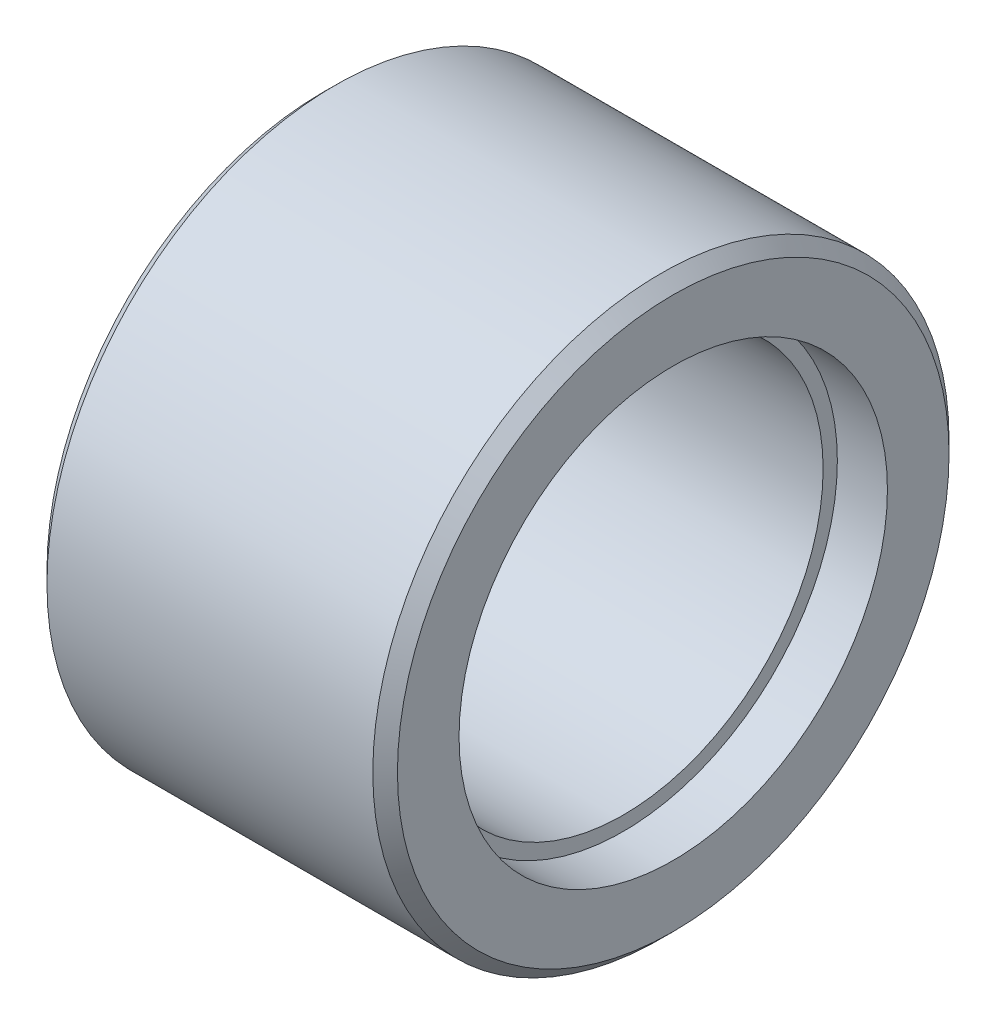
ISO-10303-21;
HEADER;
FILE_DESCRIPTION(('STEP AP214'),'2;1');
FILE_NAME('part.step','',(''),(''),'','','');
FILE_SCHEMA(('AUTOMOTIVE_DESIGN { 1 0 10303 214 1 1 1 1 }'));
ENDSEC;
DATA;
#1=APPLICATION_CONTEXT('core data for automotive mechanical design processes');
#2=APPLICATION_PROTOCOL_DEFINITION('international standard','automotive_design',2000,#1);
#3=PRODUCT_CONTEXT('',#1,'mechanical');
#4=PRODUCT('Part','Part','',(#3));
#5=PRODUCT_RELATED_PRODUCT_CATEGORY('part','',(#4));
#6=PRODUCT_DEFINITION_FORMATION('','',#4);
#7=PRODUCT_DEFINITION_CONTEXT('part definition',#1,'design');
#8=PRODUCT_DEFINITION('design','',#6,#7);
#9=PRODUCT_DEFINITION_SHAPE('','',#8);
#10=(LENGTH_UNIT() NAMED_UNIT(*) SI_UNIT(.MILLI.,.METRE.));
#11=(NAMED_UNIT(*) PLANE_ANGLE_UNIT() SI_UNIT($,.RADIAN.));
#12=(NAMED_UNIT(*) SI_UNIT($,.STERADIAN.) SOLID_ANGLE_UNIT());
#13=UNCERTAINTY_MEASURE_WITH_UNIT(LENGTH_MEASURE(1.E-05),#10,'distance_accuracy_value','');
#14=(GEOMETRIC_REPRESENTATION_CONTEXT(3) GLOBAL_UNCERTAINTY_ASSIGNED_CONTEXT((#13)) GLOBAL_UNIT_ASSIGNED_CONTEXT((#10,
#11,#12)) REPRESENTATION_CONTEXT('',''));
#15=CARTESIAN_POINT('',(0.,0.,0.));
#16=DIRECTION('',(0.,0.,1.));
#17=DIRECTION('',(1.,0.,0.));
#18=AXIS2_PLACEMENT_3D('',#15,#16,#17);
#19=CARTESIAN_POINT('',(-75.8996568668348,11.19315,0.));
#20=DIRECTION('',(-1.,0.,0.));
#21=DIRECTION('',(0.,0.,1.));
#22=AXIS2_PLACEMENT_3D('',#19,#20,#21);
#23=PLANE('',#22);
#24=CARTESIAN_POINT('',(-75.8996568668348,0.,0.));
#25=DIRECTION('',(1.,0.,0.));
#26=DIRECTION('',(0.,0.,-1.));
#27=AXIS2_PLACEMENT_3D('',#24,#25,#26);
#28=CIRCLE('',#27,8.69314999999999);
#29=CARTESIAN_POINT('',(-75.8996568668348,0.,-8.69314999999999));
#30=VERTEX_POINT('',#29);
#31=EDGE_CURVE('E10',#30,#30,#28,.T.);
#32=ORIENTED_EDGE('',*,*,#31,.T.);
#33=EDGE_LOOP('',(#32));
#34=FACE_BOUND('',#33,.T.);
#35=CARTESIAN_POINT('',(-75.8996568668348,0.,0.));
#36=DIRECTION('',(1.,0.,0.));
#37=DIRECTION('',(0.,0.,-1.));
#38=AXIS2_PLACEMENT_3D('',#35,#36,#37);
#39=CIRCLE('',#38,11.19315);
#40=CARTESIAN_POINT('',(-75.8996568668348,0.,-11.19315));
#41=VERTEX_POINT('',#40);
#42=EDGE_CURVE('E70',#41,#41,#39,.T.);
#43=ORIENTED_EDGE('',*,*,#42,.F.);
#44=EDGE_LOOP('',(#43));
#45=FACE_BOUND('',#44,.T.);
#46=ADVANCED_FACE('F36',(#34,#45),#23,.T.);
#47=CARTESIAN_POINT('',(0.,0.,0.));
#48=DIRECTION('',(1.,0.,0.));
#49=DIRECTION('',(0.,0.,-1.));
#50=AXIS2_PLACEMENT_3D('',#47,#48,#49);
#51=CYLINDRICAL_SURFACE('',#50,8.69314999999999);
#52=CARTESIAN_POINT('',(-73.8676568668348,0.,0.));
#53=DIRECTION('',(1.,0.,0.));
#54=DIRECTION('',(0.,0.,-1.));
#55=AXIS2_PLACEMENT_3D('',#52,#53,#54);
#56=CIRCLE('',#55,8.69314999999999);
#57=CARTESIAN_POINT('',(-73.8676568668348,0.,-8.69314999999999));
#58=VERTEX_POINT('',#57);
#59=EDGE_CURVE('E42',#58,#58,#56,.T.);
#60=ORIENTED_EDGE('',*,*,#59,.T.);
#61=EDGE_LOOP('',(#60));
#62=FACE_BOUND('',#61,.T.);
#63=ORIENTED_EDGE('',*,*,#31,.F.);
#64=EDGE_LOOP('',(#63));
#65=FACE_BOUND('',#64,.T.);
#66=ADVANCED_FACE('F78',(#62,#65),#51,.F.);
#67=CARTESIAN_POINT('',(-73.8676568668348,8.69314999999999,0.));
#68=DIRECTION('',(-1.,0.,0.));
#69=DIRECTION('',(0.,0.,1.));
#70=AXIS2_PLACEMENT_3D('',#67,#68,#69);
#71=PLANE('',#70);
#72=CARTESIAN_POINT('',(-73.8676568668348,0.,0.));
#73=DIRECTION('',(1.,0.,0.));
#74=DIRECTION('',(0.,0.,-1.));
#75=AXIS2_PLACEMENT_3D('',#72,#73,#74);
#76=CIRCLE('',#75,8.11529999999999);
#77=CARTESIAN_POINT('',(-73.8676568668348,0.,-8.11529999999999));
#78=VERTEX_POINT('',#77);
#79=EDGE_CURVE('E46',#78,#78,#76,.T.);
#80=ORIENTED_EDGE('',*,*,#79,.T.);
#81=EDGE_LOOP('',(#80));
#82=FACE_BOUND('',#81,.T.);
#83=ORIENTED_EDGE('',*,*,#59,.F.);
#84=EDGE_LOOP('',(#83));
#85=FACE_BOUND('',#84,.T.);
#86=ADVANCED_FACE('F82',(#82,#85),#71,.T.);
#87=CARTESIAN_POINT('',(0.,0.,0.));
#88=DIRECTION('',(1.,0.,0.));
#89=DIRECTION('',(0.,0.,-1.));
#90=AXIS2_PLACEMENT_3D('',#87,#88,#89);
#91=CYLINDRICAL_SURFACE('',#90,8.11529999999999);
#92=CARTESIAN_POINT('',(-63.7076568668348,0.,0.));
#93=DIRECTION('',(1.,0.,0.));
#94=DIRECTION('',(0.,0.,-1.));
#95=AXIS2_PLACEMENT_3D('',#92,#93,#94);
#96=CIRCLE('',#95,8.11529999999999);
#97=CARTESIAN_POINT('',(-63.7076568668348,0.,-8.11529999999999));
#98=VERTEX_POINT('',#97);
#99=EDGE_CURVE('E50',#98,#98,#96,.T.);
#100=ORIENTED_EDGE('',*,*,#99,.T.);
#101=EDGE_LOOP('',(#100));
#102=FACE_BOUND('',#101,.T.);
#103=ORIENTED_EDGE('',*,*,#79,.F.);
#104=EDGE_LOOP('',(#103));
#105=FACE_BOUND('',#104,.T.);
#106=ADVANCED_FACE('F86',(#102,#105),#91,.F.);
#107=CARTESIAN_POINT('',(-63.7076568668348,8.11529999999999,0.));
#108=DIRECTION('',(1.,0.,0.));
#109=DIRECTION('',(0.,0.,-1.));
#110=AXIS2_PLACEMENT_3D('',#107,#108,#109);
#111=PLANE('',#110);
#112=CARTESIAN_POINT('',(-63.7076568668348,0.,0.));
#113=DIRECTION('',(1.,0.,0.));
#114=DIRECTION('',(0.,0.,-1.));
#115=AXIS2_PLACEMENT_3D('',#112,#113,#114);
#116=CIRCLE('',#115,8.69315);
#117=CARTESIAN_POINT('',(-63.7076568668348,0.,-8.69315));
#118=VERTEX_POINT('',#117);
#119=EDGE_CURVE('E55',#118,#118,#116,.T.);
#120=ORIENTED_EDGE('',*,*,#119,.T.);
#121=EDGE_LOOP('',(#120));
#122=FACE_BOUND('',#121,.T.);
#123=ORIENTED_EDGE('',*,*,#99,.F.);
#124=EDGE_LOOP('',(#123));
#125=FACE_BOUND('',#124,.T.);
#126=ADVANCED_FACE('F93',(#122,#125),#111,.T.);
#127=CARTESIAN_POINT('',(0.,0.,0.));
#128=DIRECTION('',(1.,0.,0.));
#129=DIRECTION('',(0.,0.,-1.));
#130=AXIS2_PLACEMENT_3D('',#127,#128,#129);
#131=CYLINDRICAL_SURFACE('',#130,8.69314999999999);
#132=CARTESIAN_POINT('',(-61.6756568668348,0.,0.));
#133=DIRECTION('',(1.,0.,0.));
#134=DIRECTION('',(0.,0.,-1.));
#135=AXIS2_PLACEMENT_3D('',#132,#133,#134);
#136=CIRCLE('',#135,8.69314999999999);
#137=CARTESIAN_POINT('',(-61.6756568668348,0.,-8.69314999999999));
#138=VERTEX_POINT('',#137);
#139=EDGE_CURVE('E58',#138,#138,#136,.T.);
#140=ORIENTED_EDGE('',*,*,#139,.T.);
#141=EDGE_LOOP('',(#140));
#142=FACE_BOUND('',#141,.T.);
#143=ORIENTED_EDGE('',*,*,#119,.F.);
#144=EDGE_LOOP('',(#143));
#145=FACE_BOUND('',#144,.T.);
#146=ADVANCED_FACE('F97',(#142,#145),#131,.F.);
#147=CARTESIAN_POINT('',(-61.6756568668348,8.69314999999999,0.));
#148=DIRECTION('',(1.,0.,0.));
#149=DIRECTION('',(0.,0.,-1.));
#150=AXIS2_PLACEMENT_3D('',#147,#148,#149);
#151=PLANE('',#150);
#152=CARTESIAN_POINT('',(-61.6756568668348,0.,0.));
#153=DIRECTION('',(1.,0.,0.));
#154=DIRECTION('',(0.,0.,-1.));
#155=AXIS2_PLACEMENT_3D('',#152,#153,#154);
#156=CIRCLE('',#155,11.19315);
#157=CARTESIAN_POINT('',(-61.6756568668348,0.,-11.19315));
#158=VERTEX_POINT('',#157);
#159=EDGE_CURVE('E61',#158,#158,#156,.T.);
#160=ORIENTED_EDGE('',*,*,#159,.T.);
#161=EDGE_LOOP('',(#160));
#162=FACE_BOUND('',#161,.T.);
#163=ORIENTED_EDGE('',*,*,#139,.F.);
#164=EDGE_LOOP('',(#163));
#165=FACE_BOUND('',#164,.T.);
#166=ADVANCED_FACE('F101',(#162,#165),#151,.T.);
#167=CARTESIAN_POINT('',(-61.6756568668348,0.,0.));
#168=DIRECTION('',(-1.,0.,0.));
#169=DIRECTION('',(0.,0.,1.));
#170=AXIS2_PLACEMENT_3D('',#167,#168,#169);
#171=CONICAL_SURFACE('',#170,11.19315,0.785398163397448);
#172=CARTESIAN_POINT('',(-62.1756568668348,0.,0.));
#173=DIRECTION('',(1.,0.,0.));
#174=DIRECTION('',(0.,0.,-1.));
#175=AXIS2_PLACEMENT_3D('',#172,#173,#174);
#176=CIRCLE('',#175,11.69315);
#177=CARTESIAN_POINT('',(-62.1756568668348,0.,-11.69315));
#178=VERTEX_POINT('',#177);
#179=EDGE_CURVE('E64',#178,#178,#176,.T.);
#180=ORIENTED_EDGE('',*,*,#179,.T.);
#181=EDGE_LOOP('',(#180));
#182=FACE_BOUND('',#181,.T.);
#183=ORIENTED_EDGE('',*,*,#159,.F.);
#184=EDGE_LOOP('',(#183));
#185=FACE_BOUND('',#184,.T.);
#186=ADVANCED_FACE('F105',(#182,#185),#171,.T.);
#187=CARTESIAN_POINT('',(0.,0.,0.));
#188=DIRECTION('',(1.,0.,0.));
#189=DIRECTION('',(0.,0.,-1.));
#190=AXIS2_PLACEMENT_3D('',#187,#188,#189);
#191=CYLINDRICAL_SURFACE('',#190,11.69315);
#192=CARTESIAN_POINT('',(-75.3996568668348,0.,0.));
#193=DIRECTION('',(1.,0.,0.));
#194=DIRECTION('',(0.,0.,-1.));
#195=AXIS2_PLACEMENT_3D('',#192,#193,#194);
#196=CIRCLE('',#195,11.69315);
#197=CARTESIAN_POINT('',(-75.3996568668348,0.,-11.69315));
#198=VERTEX_POINT('',#197);
#199=EDGE_CURVE('E67',#198,#198,#196,.T.);
#200=ORIENTED_EDGE('',*,*,#199,.T.);
#201=EDGE_LOOP('',(#200));
#202=FACE_BOUND('',#201,.T.);
#203=ORIENTED_EDGE('',*,*,#179,.F.);
#204=EDGE_LOOP('',(#203));
#205=FACE_BOUND('',#204,.T.);
#206=ADVANCED_FACE('F109',(#202,#205),#191,.T.);
#207=CARTESIAN_POINT('',(-75.3996568668348,0.,0.));
#208=DIRECTION('',(1.,0.,0.));
#209=DIRECTION('',(0.,0.,-1.));
#210=AXIS2_PLACEMENT_3D('',#207,#208,#209);
#211=CONICAL_SURFACE('',#210,11.69315,0.785398163397448);
#212=ORIENTED_EDGE('',*,*,#42,.T.);
#213=EDGE_LOOP('',(#212));
#214=FACE_BOUND('',#213,.T.);
#215=ORIENTED_EDGE('',*,*,#199,.F.);
#216=EDGE_LOOP('',(#215));
#217=FACE_BOUND('',#216,.T.);
#218=ADVANCED_FACE('F74',(#214,#217),#211,.T.);
#219=CLOSED_SHELL('',(#46,#66,#86,#106,#126,#146,#166,#186,#206,#218));
#220=MANIFOLD_SOLID_BREP('B2',#219);
#221=ADVANCED_BREP_SHAPE_REPRESENTATION('',(#18,#220),#14);
#222=SHAPE_DEFINITION_REPRESENTATION(#9,#221);
ENDSEC;
END-ISO-10303-21;
